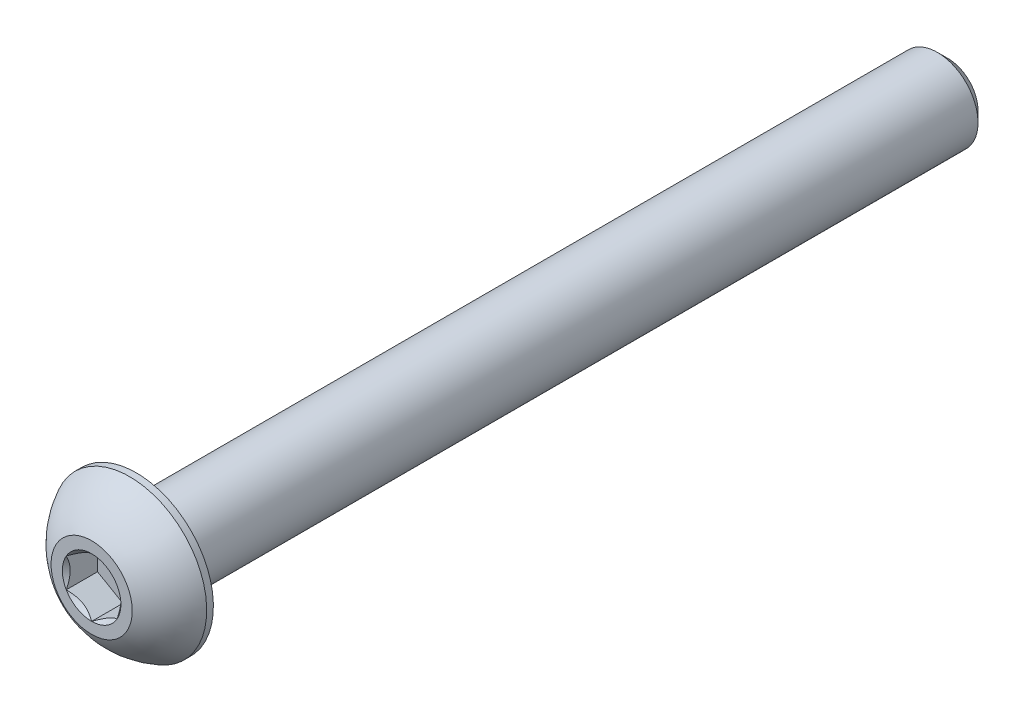
ISO-10303-21;
HEADER;
FILE_DESCRIPTION(('STEP AP214'),'2;1');
FILE_NAME('part.step','',(''),(''),'','','');
FILE_SCHEMA(('AUTOMOTIVE_DESIGN { 1 0 10303 214 1 1 1 1 }'));
ENDSEC;
DATA;
#1=APPLICATION_CONTEXT('core data for automotive mechanical design processes');
#2=APPLICATION_PROTOCOL_DEFINITION('international standard','automotive_design',2000,#1);
#3=PRODUCT_CONTEXT('',#1,'mechanical');
#4=PRODUCT('Part','Part','',(#3));
#5=PRODUCT_RELATED_PRODUCT_CATEGORY('part','',(#4));
#6=PRODUCT_DEFINITION_FORMATION('','',#4);
#7=PRODUCT_DEFINITION_CONTEXT('part definition',#1,'design');
#8=PRODUCT_DEFINITION('design','',#6,#7);
#9=PRODUCT_DEFINITION_SHAPE('','',#8);
#10=(LENGTH_UNIT() NAMED_UNIT(*) SI_UNIT(.MILLI.,.METRE.));
#11=(NAMED_UNIT(*) PLANE_ANGLE_UNIT() SI_UNIT($,.RADIAN.));
#12=(NAMED_UNIT(*) SI_UNIT($,.STERADIAN.) SOLID_ANGLE_UNIT());
#13=UNCERTAINTY_MEASURE_WITH_UNIT(LENGTH_MEASURE(1.E-05),#10,'distance_accuracy_value','');
#14=(GEOMETRIC_REPRESENTATION_CONTEXT(3) GLOBAL_UNCERTAINTY_ASSIGNED_CONTEXT((#13)) GLOBAL_UNIT_ASSIGNED_CONTEXT((#10,
#11,#12)) REPRESENTATION_CONTEXT('',''));
#15=CARTESIAN_POINT('',(0.,0.,0.));
#16=DIRECTION('',(0.,0.,1.));
#17=DIRECTION('',(1.,0.,0.));
#18=AXIS2_PLACEMENT_3D('',#15,#16,#17);
#19=CARTESIAN_POINT('',(0.,0.,22.2));
#20=DIRECTION('',(0.,0.,1.));
#21=DIRECTION('',(0.,-1.,0.));
#22=AXIS2_PLACEMENT_3D('',#19,#20,#21);
#23=CYLINDRICAL_SURFACE('',#22,1.99999999999999);
#24=CARTESIAN_POINT('',(0.,0.,20.));
#25=DIRECTION('',(0.,0.,1.));
#26=DIRECTION('',(0.,-1.,0.));
#27=AXIS2_PLACEMENT_3D('',#24,#25,#26);
#28=CIRCLE('',#27,1.99999999999999);
#29=CARTESIAN_POINT('',(0.,-2.,20.));
#30=VERTEX_POINT('',#29);
#31=EDGE_CURVE('E54',#30,#30,#28,.T.);
#32=ORIENTED_EDGE('',*,*,#31,.F.);
#33=EDGE_LOOP('',(#32));
#34=FACE_BOUND('',#33,.T.);
#35=CARTESIAN_POINT('',(0.,0.,-19.475));
#36=DIRECTION('',(0.,0.,1.));
#37=DIRECTION('',(0.,-1.,0.));
#38=AXIS2_PLACEMENT_3D('',#35,#36,#37);
#39=CIRCLE('',#38,1.99999999999999);
#40=CARTESIAN_POINT('',(0.,-2.,-19.475));
#41=VERTEX_POINT('',#40);
#42=EDGE_CURVE('E182',#41,#41,#39,.T.);
#43=ORIENTED_EDGE('',*,*,#42,.T.);
#44=EDGE_LOOP('',(#43));
#45=FACE_BOUND('',#44,.T.);
#46=ADVANCED_FACE('F41',(#34,#45),#23,.T.);
#47=CARTESIAN_POINT('',(0.,0.,-20.));
#48=DIRECTION('',(0.,0.,1.));
#49=DIRECTION('',(0.,-1.,0.));
#50=AXIS2_PLACEMENT_3D('',#47,#48,#49);
#51=PLANE('',#50);
#52=CARTESIAN_POINT('',(0.,0.,-20.));
#53=DIRECTION('',(0.,0.,1.));
#54=DIRECTION('',(0.,-1.,0.));
#55=AXIS2_PLACEMENT_3D('',#52,#53,#54);
#56=CIRCLE('',#55,1.47499999999999);
#57=CARTESIAN_POINT('',(0.,-1.475,-20.));
#58=VERTEX_POINT('',#57);
#59=EDGE_CURVE('E185',#58,#58,#56,.T.);
#60=ORIENTED_EDGE('',*,*,#59,.F.);
#61=EDGE_LOOP('',(#60));
#62=FACE_BOUND('',#61,.T.);
#63=ADVANCED_FACE('F194',(#62),#51,.F.);
#64=CARTESIAN_POINT('',(0.,0.,-20.));
#65=DIRECTION('',(0.,0.,1.));
#66=DIRECTION('',(0.,-1.,0.));
#67=AXIS2_PLACEMENT_3D('',#64,#65,#66);
#68=CONICAL_SURFACE('',#67,1.47499999999999,0.785398163397449);
#69=ORIENTED_EDGE('',*,*,#42,.F.);
#70=EDGE_LOOP('',(#69));
#71=FACE_BOUND('',#70,.T.);
#72=ORIENTED_EDGE('',*,*,#59,.T.);
#73=EDGE_LOOP('',(#72));
#74=FACE_BOUND('',#73,.T.);
#75=ADVANCED_FACE('F197',(#71,#74),#68,.T.);
#76=CARTESIAN_POINT('',(0.,-3.79999999999999,20.));
#77=DIRECTION('',(0.,0.,1.));
#78=DIRECTION('',(0.,-1.,0.));
#79=AXIS2_PLACEMENT_3D('',#76,#77,#78);
#80=PLANE('',#79);
#81=CARTESIAN_POINT('',(0.,0.,20.));
#82=DIRECTION('',(0.,0.,1.));
#83=DIRECTION('',(0.,-1.,0.));
#84=AXIS2_PLACEMENT_3D('',#81,#82,#83);
#85=CIRCLE('',#84,3.79999999999999);
#86=CARTESIAN_POINT('',(0.,-3.79999999999999,20.));
#87=VERTEX_POINT('',#86);
#88=EDGE_CURVE('E176',#87,#87,#85,.T.);
#89=ORIENTED_EDGE('',*,*,#88,.F.);
#90=EDGE_LOOP('',(#89));
#91=FACE_BOUND('',#90,.T.);
#92=ORIENTED_EDGE('',*,*,#31,.T.);
#93=EDGE_LOOP('',(#92));
#94=FACE_BOUND('',#93,.T.);
#95=ADVANCED_FACE('F190',(#91,#94),#80,.F.);
#96=CARTESIAN_POINT('',(0.,0.,18.4735561497326));
#97=DIRECTION('',(0.,0.,1.));
#98=DIRECTION('',(0.,-1.,0.));
#99=AXIS2_PLACEMENT_3D('',#96,#97,#98);
#100=SPHERICAL_SURFACE('',#99,4.22922968981298);
#101=CARTESIAN_POINT('',(0.,0.,22.2));
#102=DIRECTION('',(0.,0.,1.));
#103=DIRECTION('',(0.,-1.,0.));
#104=AXIS2_PLACEMENT_3D('',#101,#102,#103);
#105=CIRCLE('',#104,1.99999999999998);
#106=CARTESIAN_POINT('',(0.,-1.99999999999998,22.2));
#107=VERTEX_POINT('',#106);
#108=EDGE_CURVE('E179',#107,#107,#105,.T.);
#109=CARTESIAN_POINT('',(0.,0.,20.33));
#110=DIRECTION('',(0.,0.,1.));
#111=DIRECTION('',(0.,-1.,0.));
#112=AXIS2_PLACEMENT_3D('',#109,#110,#111);
#113=CIRCLE('',#112,3.79999999999999);
#114=CARTESIAN_POINT('',(0.,-3.79999999999999,20.33));
#115=VERTEX_POINT('',#114);
#116=EDGE_CURVE('E173',#115,#115,#113,.T.);
#117=CARTESIAN_POINT('',(0.,-1.99999999999998,22.2));
#118=CARTESIAN_POINT('',(0.,-2.02421343985612,22.1870045740355));
#119=CARTESIAN_POINT('',(0.,-2.04830018323972,22.1737730870349));
#120=CARTESIAN_POINT('',(0.,-2.09621120342124,22.1468431584943));
#121=CARTESIAN_POINT('',(0.,-2.12003548021915,22.1331447169543));
#122=CARTESIAN_POINT('',(0.,-2.16741249358865,22.105286046868));
#123=CARTESIAN_POINT('',(0.,-2.19096523016024,22.0911258183216));
#124=CARTESIAN_POINT('',(0.,-2.23779021933681,22.062348964764));
#125=CARTESIAN_POINT('',(0.,-2.26106247194179,22.0477323397528));
#126=CARTESIAN_POINT('',(0.,-2.3073176488607,22.0180482444859));
#127=CARTESIAN_POINT('',(0.,-2.33030057317463,22.0029807742302));
#128=CARTESIAN_POINT('',(0.,-2.37596836104233,21.9724007144171));
#129=CARTESIAN_POINT('',(0.,-2.3986532245961,21.9568881248597));
#130=CARTESIAN_POINT('',(0.,-2.44371627121512,21.9254237206041));
#131=CARTESIAN_POINT('',(0.,-2.46609445428036,21.9094719059059));
#132=CARTESIAN_POINT('',(0.,-2.5105356368618,21.8771351126683));
#133=CARTESIAN_POINT('',(0.,-2.53259863637799,21.8607501341289));
#134=CARTESIAN_POINT('',(0.,-2.5764010685249,21.8275532390328));
#135=CARTESIAN_POINT('',(0.,-2.59814050115562,21.8107413224761));
#136=CARTESIAN_POINT('',(0.,-2.64128753915152,21.7766969394119));
#137=CARTESIAN_POINT('',(0.,-2.66269514451669,21.7594644729043));
#138=CARTESIAN_POINT('',(0.,-2.70517039368394,21.724585537797));
#139=CARTESIAN_POINT('',(0.,-2.72623803748601,21.7069390691974));
#140=CARTESIAN_POINT('',(0.,-2.76802535840617,21.6712388350756));
#141=CARTESIAN_POINT('',(0.,-2.78874503552427,21.6531850695534));
#142=CARTESIAN_POINT('',(0.,-2.82982855017312,21.6166771015172));
#143=CARTESIAN_POINT('',(0.,-2.85019238770387,21.5982228990032));
#144=CARTESIAN_POINT('',(0.,-2.89055648548393,21.560921069069));
#145=CARTESIAN_POINT('',(0.,-2.91055674573322,21.5420734416488));
#146=CARTESIAN_POINT('',(0.,-2.95018608940551,21.5039919234787));
#147=CARTESIAN_POINT('',(0.,-2.96981517282851,21.4847580327288));
#148=CARTESIAN_POINT('',(0.,-3.00869470434026,21.4459112962447));
#149=CARTESIAN_POINT('',(0.,-3.02794515242902,21.4262984505106));
#150=CARTESIAN_POINT('',(0.,-3.06606009863532,21.3867012563963));
#151=CARTESIAN_POINT('',(0.,-3.08492459675285,21.3667169080161));
#152=CARTESIAN_POINT('',(0.,-3.12226047503001,21.3263843021083));
#153=CARTESIAN_POINT('',(0.,-3.14073185518963,21.3060360445808));
#154=CARTESIAN_POINT('',(0.,-3.1772744789382,21.2649833521526));
#155=CARTESIAN_POINT('',(0.,-3.19534572252714,21.2442789172519));
#156=CARTESIAN_POINT('',(0.,-3.23108120656241,21.202521737189));
#157=CARTESIAN_POINT('',(0.,-3.24874544700874,21.1814689920269));
#158=CARTESIAN_POINT('',(0.,-3.28366021283672,21.139023190901));
#159=CARTESIAN_POINT('',(0.,-3.30091073821837,21.1176301349374));
#160=CARTESIAN_POINT('',(0.,-3.33499151919533,21.0745118409772));
#161=CARTESIAN_POINT('',(0.,-3.35182177479063,21.0527866029806));
#162=CARTESIAN_POINT('',(0.,-3.3850556211637,21.0090121999432));
#163=CARTESIAN_POINT('',(0.,-3.40145921194148,20.9869630349023));
#164=CARTESIAN_POINT('',(0.,-3.43383349577046,20.9425491558485));
#165=CARTESIAN_POINT('',(0.,-3.44980418882165,20.9201844418356));
#166=CARTESIAN_POINT('',(0.,-3.48130660877274,20.8751479628077));
#167=CARTESIAN_POINT('',(0.,-3.49683833567263,20.8524761977926));
#168=CARTESIAN_POINT('',(0.,-3.5274569217093,20.8068342314103));
#169=CARTESIAN_POINT('',(0.,-3.54254378084609,20.7838640300431));
#170=CARTESIAN_POINT('',(0.,-3.57226689871517,20.7376339189694));
#171=CARTESIAN_POINT('',(0.,-3.58690315744747,20.7143740092629));
#172=CARTESIAN_POINT('',(0.,-3.61571951333198,20.6675733197334));
#173=CARTESIAN_POINT('',(0.,-3.62989961048421,20.6440325399103));
#174=CARTESIAN_POINT('',(0.,-3.65779825442822,20.5966790546141));
#175=CARTESIAN_POINT('',(0.,-3.67151680122002,20.5728663491409));
#176=CARTESIAN_POINT('',(0.,-3.69848713452321,20.5249780621223));
#177=CARTESIAN_POINT('',(0.,-3.71173892103461,20.5009024805769));
#178=CARTESIAN_POINT('',(0.,-3.73777068821037,20.4524975842079));
#179=CARTESIAN_POINT('',(0.,-3.75055066887473,20.4281682693843));
#180=CARTESIAN_POINT('',(0.,-3.77563400658953,20.3792651705548));
#181=CARTESIAN_POINT('',(0.,-3.78793736363996,20.354691386549));
#182=CARTESIAN_POINT('',(0.,-3.79999999999999,20.33));
#183=B_SPLINE_CURVE_WITH_KNOTS('',3,(#117,#118,#119,#120,#121,#122,#123,#124,#125,#126,#127,
#128,#129,#130,#131,#132,#133,#134,#135,#136,#137,#138,#139,#140,#141,#142,#143,#144,#145,#146,
#147,#148,#149,#150,#151,#152,#153,#154,#155,#156,#157,#158,#159,#160,#161,#162,#163,#164,#165,
#166,#167,#168,#169,#170,#171,#172,#173,#174,#175,#176,#177,#178,#179,#180,#181,#182),
.UNSPECIFIED.,.F.,.F.,(4,2,2,2,2,2,2,2,2,2,2,2,2,2,2,2,2,2,2,2,2,2,2,2,2,2,2,2,2,2,2,2,4),(0.,
0.0824398589102662,0.16487971782053,0.247319576730794,0.329759435641058,0.412199294551324,
0.494639153461589,0.577079012371851,0.659518871282117,0.741958730192382,0.824398589102647,
0.906838448012911,0.989278306923174,1.07171816583344,1.1541580247437,1.23659788365397,
1.31903774256423,1.4014776014745,1.48391746038476,1.56635731929503,1.64879717820529,
1.73123703711555,1.81367689602582,1.89611675493608,1.97855661384635,2.06099647275661,
2.14343633166688,2.22587619057714,2.30831604948741,2.39075590839767,2.47319576730794,
2.5556356262182,2.63807548512846),.UNSPECIFIED.);
#184=EDGE_CURVE('BSEAM207',#107,#115,#183,.T.);
#185=ORIENTED_EDGE('',*,*,#108,.F.);
#186=ORIENTED_EDGE('',*,*,#116,.T.);
#187=ORIENTED_EDGE('',*,*,#184,.T.);
#188=ORIENTED_EDGE('',*,*,#184,.F.);
#189=EDGE_LOOP('',(#185,#187,#186,#188));
#190=FACE_BOUND('',#189,.T.);
#191=ADVANCED_FACE('F207',(#190),#100,.T.);
#192=CARTESIAN_POINT('',(0.,-1.99999999999999,22.2));
#193=DIRECTION('',(0.,0.,-1.));
#194=DIRECTION('',(0.,1.,0.));
#195=AXIS2_PLACEMENT_3D('',#192,#193,#194);
#196=PLANE('',#195);
#197=CARTESIAN_POINT('',(0.,0.,22.2));
#198=DIRECTION('',(0.,0.,1.));
#199=DIRECTION('',(1.,0.,0.));
#200=AXIS2_PLACEMENT_3D('',#197,#198,#199);
#201=CIRCLE('',#200,1.44337567297405);
#202=CARTESIAN_POINT('',(0.,1.44337567297405,22.2));
#203=VERTEX_POINT('',#202);
#204=CARTESIAN_POINT('',(-1.24999999999998,0.721687836487031,22.2));
#205=VERTEX_POINT('',#204);
#206=EDGE_CURVE('E140',#203,#205,#201,.T.);
#207=ORIENTED_EDGE('',*,*,#206,.F.);
#208=CARTESIAN_POINT('',(1.24999999999999,0.721687836487024,22.2));
#209=VERTEX_POINT('',#208);
#210=EDGE_CURVE('E137',#209,#203,#201,.T.);
#211=ORIENTED_EDGE('',*,*,#210,.F.);
#212=CARTESIAN_POINT('',(1.24999999999999,-0.721687836487023,22.2));
#213=VERTEX_POINT('',#212);
#214=EDGE_CURVE('E107',#213,#209,#201,.T.);
#215=ORIENTED_EDGE('',*,*,#214,.F.);
#216=CARTESIAN_POINT('',(0.,-1.44337567297405,22.2));
#217=VERTEX_POINT('',#216);
#218=EDGE_CURVE('E99',#217,#213,#201,.T.);
#219=ORIENTED_EDGE('',*,*,#218,.F.);
#220=CARTESIAN_POINT('',(-1.24999999999999,-0.721687836487024,22.2));
#221=VERTEX_POINT('',#220);
#222=EDGE_CURVE('E60',#221,#217,#201,.T.);
#223=ORIENTED_EDGE('',*,*,#222,.F.);
#224=EDGE_CURVE('E67',#205,#221,#201,.T.);
#225=ORIENTED_EDGE('',*,*,#224,.F.);
#226=EDGE_LOOP('',(#207,#211,#215,#219,#223,#225));
#227=FACE_BOUND('',#226,.T.);
#228=ORIENTED_EDGE('',*,*,#108,.T.);
#229=EDGE_LOOP('',(#228));
#230=FACE_BOUND('',#229,.T.);
#231=ADVANCED_FACE('F134',(#227,#230),#196,.F.);
#232=CARTESIAN_POINT('',(0.,0.,22.2));
#233=DIRECTION('',(0.,0.,1.));
#234=DIRECTION('',(0.,-1.,0.));
#235=AXIS2_PLACEMENT_3D('',#232,#233,#234);
#236=CYLINDRICAL_SURFACE('',#235,3.79999999999999);
#237=ORIENTED_EDGE('',*,*,#116,.F.);
#238=EDGE_LOOP('',(#237));
#239=FACE_BOUND('',#238,.T.);
#240=ORIENTED_EDGE('',*,*,#88,.T.);
#241=EDGE_LOOP('',(#240));
#242=FACE_BOUND('',#241,.T.);
#243=ADVANCED_FACE('F213',(#239,#242),#236,.T.);
#244=CARTESIAN_POINT('',(0.,0.,22.2));
#245=DIRECTION('',(0.,0.,1.));
#246=DIRECTION('',(1.,0.,0.));
#247=AXIS2_PLACEMENT_3D('',#244,#245,#246);
#248=CONICAL_SURFACE('',#247,1.44337567297405,0.78539816339745);
#249=ORIENTED_EDGE('',*,*,#214,.T.);
#250=CARTESIAN_POINT('',(1.24999999999999,-1.43934010808074,22.6629820968923));
#251=CARTESIAN_POINT('',(1.24999999999999,-1.40429313005656,22.6365249226329));
#252=CARTESIAN_POINT('',(1.24999999999999,-1.36905087135596,22.6103271603543));
#253=CARTESIAN_POINT('',(1.24999999999999,-1.29809650706308,22.5585575718396));
#254=CARTESIAN_POINT('',(1.24999999999999,-1.26238428576493,22.5329859043563));
#255=CARTESIAN_POINT('',(1.24999999999999,-1.15390111792705,22.4570059936895));
#256=CARTESIAN_POINT('',(1.24999999999999,-1.08031646726262,22.4077402861896));
#257=CARTESIAN_POINT('',(1.24999999999999,-0.926012322755073,22.3110258302631));
#258=CARTESIAN_POINT('',(1.24999999999999,-0.845125318656126,22.2638412989418));
#259=CARTESIAN_POINT('',(1.24999999999999,-0.679311174076585,22.1775307343904));
#260=CARTESIAN_POINT('',(1.24999999999999,-0.594398891026673,22.1383775346269));
#261=CARTESIAN_POINT('',(1.24999999999999,-0.466944812460728,22.0904772236883));
#262=CARTESIAN_POINT('',(1.24999999999999,-0.42628998581281,22.0767294897863));
#263=CARTESIAN_POINT('',(1.24999999999999,-0.343998850091258,22.0524979274505));
#264=CARTESIAN_POINT('',(1.24999999999999,-0.302362473614954,22.0420143238698));
#265=CARTESIAN_POINT('',(1.24999999999999,-0.219052696285659,22.0250301617483));
#266=CARTESIAN_POINT('',(1.24999999999999,-0.177393428474494,22.0184613604714));
#267=CARTESIAN_POINT('',(1.24999999999999,-0.0936293693401874,22.0094350534578));
#268=CARTESIAN_POINT('',(1.24999999999999,-0.0515246558543922,22.0069768409973));
#269=CARTESIAN_POINT('',(1.24999999999999,0.0311890576306342,22.0063540620133));
#270=CARTESIAN_POINT('',(1.24999999999999,0.0717969625499327,22.0080371168462));
#271=CARTESIAN_POINT('',(1.24999999999999,0.152668636885199,22.0152682705979));
#272=CARTESIAN_POINT('',(1.24999999999999,0.192932338835359,22.0208171104131));
#273=CARTESIAN_POINT('',(1.24999999999999,0.273499879165296,22.035571036465));
#274=CARTESIAN_POINT('',(1.24999999999999,0.313792180618511,22.0448381759641));
#275=CARTESIAN_POINT('',(1.24999999999999,0.393496413911456,22.0665361784573));
#276=CARTESIAN_POINT('',(1.24999999999999,0.432908419115057,22.0789667767306));
#277=CARTESIAN_POINT('',(1.24999999999999,0.556992735862295,22.1227793529314));
#278=CARTESIAN_POINT('',(1.24999999999999,0.639898924666083,22.159151072876));
#279=CARTESIAN_POINT('',(1.24999999999999,0.801816555499699,22.2400191621783));
#280=CARTESIAN_POINT('',(1.24999999999999,0.880812666325041,22.284544720912));
#281=CARTESIAN_POINT('',(1.24999999999999,1.03178561279749,22.3764048766666));
#282=CARTESIAN_POINT('',(1.24999999999999,1.10391618485085,22.4234899339163));
#283=CARTESIAN_POINT('',(1.24999999999999,1.2101860604331,22.4962785615985));
#284=CARTESIAN_POINT('',(1.24999999999999,1.24515069969379,22.5207980853934));
#285=CARTESIAN_POINT('',(1.24999999999999,1.31460220852736,22.5704856367657));
#286=CARTESIAN_POINT('',(1.24999999999999,1.34908920596617,22.5956534854155));
#287=CARTESIAN_POINT('',(1.24999999999999,1.38337731682911,22.6210901488412));
#288=B_SPLINE_CURVE_WITH_KNOTS('',3,(#250,#251,#252,#253,#254,#255,#256,#257,#258,#259,#260,
#261,#262,#263,#264,#265,#266,#267,#268,#269,#270,#271,#272,#273,#274,#275,#276,#277,#278,#279,
#280,#281,#282,#283,#284,#285,#286,#287),.UNSPECIFIED.,.F.,.F.,(4,2,2,2,2,2,2,2,2,2,2,2,2,2,2,2,
2,2,4),(0.,0.131732960381445,0.26349898416164,0.529042014455814,0.809741926134603,
1.08947609717223,1.21811634272574,1.34676544783898,1.47310084517841,1.59941451973781,
1.72115042167846,1.84290966131731,1.96679153905338,2.09066305366035,2.36146692896005,
2.63325989198487,2.89154668212275,3.01965734507708,3.14773302245623),.UNSPECIFIED.);
#289=EDGE_CURVE('E11',#213,#209,#288,.T.);
#290=ORIENTED_EDGE('',*,*,#289,.F.);
#291=EDGE_LOOP('',(#249,#290));
#292=FACE_BOUND('',#291,.T.);
#293=ADVANCED_FACE('F111',(#292),#248,.F.);
#294=ORIENTED_EDGE('',*,*,#210,.T.);
#295=CARTESIAN_POINT('',(1.25019999999999,0.721572366433191,22.2001154839091));
#296=CARTESIAN_POINT('',(1.2072248329284,0.746384090710441,22.1753216680551));
#297=CARTESIAN_POINT('',(1.16353099525404,0.77161073965366,22.1519837344187));
#298=CARTESIAN_POINT('',(1.07443406915805,0.82305087391915,22.1092520040845));
#299=CARTESIAN_POINT('',(1.02902250164292,0.849269254648328,22.0898819923604));
#300=CARTESIAN_POINT('',(0.93745217906473,0.90213740503863,22.0567004834135));
#301=CARTESIAN_POINT('',(0.891316759824104,0.928773701756381,22.0428055590527));
#302=CARTESIAN_POINT('',(0.798029919592398,0.982632884076006,22.0213972821606));
#303=CARTESIAN_POINT('',(0.750881350863611,1.00985412292348,22.0138679415668));
#304=CARTESIAN_POINT('',(0.66962644311274,1.05676666578642,22.0070744980507));
#305=CARTESIAN_POINT('',(0.635625123372051,1.07639733689151,22.0060685591044));
#306=CARTESIAN_POINT('',(0.567682235567516,1.11562418145498,22.0077614149113));
#307=CARTESIAN_POINT('',(0.533740682344336,1.1352203463451,22.0104610272155));
#308=CARTESIAN_POINT('',(0.466185143542494,1.17422355485759,22.0194089303164));
#309=CARTESIAN_POINT('',(0.432571492713219,1.19363040521232,22.0256605258997));
#310=CARTESIAN_POINT('',(0.365905361782182,1.23212011385118,22.0413756814139));
#311=CARTESIAN_POINT('',(0.332853128969699,1.25120282936279,22.0508406200875));
#312=CARTESIAN_POINT('',(0.248200308399732,1.30007715810652,22.0789313906876));
#313=CARTESIAN_POINT('',(0.197133507570359,1.32956058931201,22.0996701574522));
#314=CARTESIAN_POINT('',(0.0969991458867442,1.38737318998518,22.1463871346715));
#315=CARTESIAN_POINT('',(0.0479256884217302,1.41570576386267,22.1723482959468));
#316=CARTESIAN_POINT('',(-0.000199999999999777,1.44349114302789,22.2001154839091));
#317=B_SPLINE_CURVE_WITH_KNOTS('',3,(#295,#296,#297,#298,#299,#300,#301,#302,#303,#304,#305,
#306,#307,#308,#309,#310,#311,#312,#313,#314,#315,#316),.UNSPECIFIED.,.F.,.F.,(4,2,2,2,2,2,2,2,
2,2,4),(0.,0.1665334096183,0.334037607289757,0.498880396489691,0.663307919240266,
0.780963963458817,0.898645970148442,1.01643764860772,1.13427993171548,1.32148652032139,
1.50809158792572),.UNSPECIFIED.);
#318=EDGE_CURVE('E139',#209,#203,#317,.T.);
#319=ORIENTED_EDGE('',*,*,#318,.F.);
#320=EDGE_LOOP('',(#294,#319));
#321=FACE_BOUND('',#320,.T.);
#322=ADVANCED_FACE('F292',(#321),#248,.F.);
#323=ORIENTED_EDGE('',*,*,#206,.T.);
#324=CARTESIAN_POINT('',(0.000199999999999752,1.44349114302789,22.2001154839091));
#325=CARTESIAN_POINT('',(-0.0427751670715864,1.41867941875064,22.1753216680551));
#326=CARTESIAN_POINT('',(-0.0864690047459476,1.39345276980742,22.1519837344187));
#327=CARTESIAN_POINT('',(-0.175565930841941,1.34201263554193,22.1092520040845));
#328=CARTESIAN_POINT('',(-0.220977498357063,1.31579425481275,22.0898819923604));
#329=CARTESIAN_POINT('',(-0.312547820935258,1.26292610442245,22.0567004834135));
#330=CARTESIAN_POINT('',(-0.358683240175883,1.2362898077047,22.0428055590527));
#331=CARTESIAN_POINT('',(-0.451970080407589,1.18243062538507,22.0213972821606));
#332=CARTESIAN_POINT('',(-0.499118649136376,1.1552093865376,22.0138679415668));
#333=CARTESIAN_POINT('',(-0.580373556887248,1.10829684367466,22.0070744980507));
#334=CARTESIAN_POINT('',(-0.614374876627937,1.08866617256957,22.0060685591044));
#335=CARTESIAN_POINT('',(-0.682317764432473,1.0494393280061,22.0077614149113));
#336=CARTESIAN_POINT('',(-0.716259317655652,1.02984316311598,22.0104610272155));
#337=CARTESIAN_POINT('',(-0.783814856457494,0.990839954603491,22.0194089303164));
#338=CARTESIAN_POINT('',(-0.817428507286769,0.971433104248763,22.0256605258997));
#339=CARTESIAN_POINT('',(-0.884094638217807,0.932943395609897,22.0413756814139));
#340=CARTESIAN_POINT('',(-0.917146871030289,0.913860680098292,22.0508406200875));
#341=CARTESIAN_POINT('',(-1.00179969160026,0.86498635135456,22.0789313906876));
#342=CARTESIAN_POINT('',(-1.05286649242963,0.835502920149069,22.0996701574522));
#343=CARTESIAN_POINT('',(-1.15300085411324,0.777690319475904,22.1463871346715));
#344=CARTESIAN_POINT('',(-1.20207431157826,0.749357745598413,22.1723482959468));
#345=CARTESIAN_POINT('',(-1.25019999999998,0.721572366433191,22.2001154839091));
#346=B_SPLINE_CURVE_WITH_KNOTS('',3,(#324,#325,#326,#327,#328,#329,#330,#331,#332,#333,#334,
#335,#336,#337,#338,#339,#340,#341,#342,#343,#344,#345),.UNSPECIFIED.,.F.,.F.,(4,2,2,2,2,2,2,2,
2,2,4),(0.,0.166533409618303,0.334037607289759,0.498880396489694,0.663307919240269,
0.780963963458821,0.898645970148446,1.01643764860773,1.13427993171549,1.32148652032139,
1.50809158792572),.UNSPECIFIED.);
#347=EDGE_CURVE('E143',#203,#205,#346,.T.);
#348=ORIENTED_EDGE('',*,*,#347,.F.);
#349=EDGE_LOOP('',(#323,#348));
#350=FACE_BOUND('',#349,.T.);
#351=ADVANCED_FACE('F146',(#350),#248,.F.);
#352=ORIENTED_EDGE('',*,*,#224,.T.);
#353=CARTESIAN_POINT('',(-1.24999999999999,-1.43934010808074,22.6629820968923));
#354=CARTESIAN_POINT('',(-1.24999999999999,-1.40429313005656,22.6365249226329));
#355=CARTESIAN_POINT('',(-1.24999999999999,-1.36905087135597,22.6103271603543));
#356=CARTESIAN_POINT('',(-1.24999999999999,-1.29809650706308,22.5585575718396));
#357=CARTESIAN_POINT('',(-1.24999999999999,-1.26238428576493,22.5329859043563));
#358=CARTESIAN_POINT('',(-1.24999999999999,-1.15390111792706,22.4570059936895));
#359=CARTESIAN_POINT('',(-1.24999999999999,-1.08031646726262,22.4077402861896));
#360=CARTESIAN_POINT('',(-1.24999999999999,-0.926012322755076,22.3110258302631));
#361=CARTESIAN_POINT('',(-1.24999999999999,-0.845125318656129,22.2638412989418));
#362=CARTESIAN_POINT('',(-1.24999999999999,-0.679311174076588,22.1775307343904));
#363=CARTESIAN_POINT('',(-1.24999999999999,-0.594398891026677,22.1383775346269));
#364=CARTESIAN_POINT('',(-1.24999999999999,-0.466944812460732,22.0904772236883));
#365=CARTESIAN_POINT('',(-1.24999999999999,-0.426289985812813,22.0767294897863));
#366=CARTESIAN_POINT('',(-1.24999999999999,-0.34399885009126,22.0524979274505));
#367=CARTESIAN_POINT('',(-1.24999999999999,-0.302362473614956,22.0420143238698));
#368=CARTESIAN_POINT('',(-1.24999999999999,-0.219052696285661,22.0250301617483));
#369=CARTESIAN_POINT('',(-1.24999999999999,-0.177393428474496,22.0184613604714));
#370=CARTESIAN_POINT('',(-1.24999999999999,-0.0936293693401889,22.0094350534578));
#371=CARTESIAN_POINT('',(-1.24999999999999,-0.0515246558543934,22.0069768409973));
#372=CARTESIAN_POINT('',(-1.24999999999999,0.0311890576306331,22.0063540620133));
#373=CARTESIAN_POINT('',(-1.24999999999999,0.0717969625499313,22.0080371168462));
#374=CARTESIAN_POINT('',(-1.24999999999999,0.152668636885197,22.0152682705979));
#375=CARTESIAN_POINT('',(-1.24999999999999,0.192932338835357,22.0208171104131));
#376=CARTESIAN_POINT('',(-1.24999999999999,0.273499879165293,22.035571036465));
#377=CARTESIAN_POINT('',(-1.24999999999999,0.313792180618508,22.0448381759641));
#378=CARTESIAN_POINT('',(-1.24999999999999,0.393496413911453,22.0665361784573));
#379=CARTESIAN_POINT('',(-1.24999999999999,0.432908419115055,22.0789667767306));
#380=CARTESIAN_POINT('',(-1.24999999999999,0.556992735862293,22.1227793529314));
#381=CARTESIAN_POINT('',(-1.24999999999999,0.639898924666079,22.159151072876));
#382=CARTESIAN_POINT('',(-1.24999999999999,0.801816555499693,22.2400191621783));
#383=CARTESIAN_POINT('',(-1.24999999999999,0.880812666325035,22.284544720912));
#384=CARTESIAN_POINT('',(-1.24999999999999,1.03178561279749,22.3764048766666));
#385=CARTESIAN_POINT('',(-1.24999999999999,1.10391618485084,22.4234899339162));
#386=CARTESIAN_POINT('',(-1.24999999999999,1.21018606043309,22.4962785615985));
#387=CARTESIAN_POINT('',(-1.24999999999999,1.24515069969378,22.5207980853934));
#388=CARTESIAN_POINT('',(-1.24999999999999,1.31460220852735,22.5704856367657));
#389=CARTESIAN_POINT('',(-1.24999999999999,1.34908920596617,22.5956534854155));
#390=CARTESIAN_POINT('',(-1.24999999999999,1.3833773168291,22.6210901488412));
#391=B_SPLINE_CURVE_WITH_KNOTS('',3,(#353,#354,#355,#356,#357,#358,#359,#360,#361,#362,#363,
#364,#365,#366,#367,#368,#369,#370,#371,#372,#373,#374,#375,#376,#377,#378,#379,#380,#381,#382,
#383,#384,#385,#386,#387,#388,#389,#390),.UNSPECIFIED.,.F.,.F.,(4,2,2,2,2,2,2,2,2,2,2,2,2,2,2,2,
2,2,4),(0.,0.131732960381446,0.263498984161639,0.529042014455817,0.809741926134605,
1.08947609717223,1.21811634272574,1.34676544783898,1.47310084517841,1.59941451973781,
1.72115042167846,1.84290966131731,1.96679153905338,2.09066305366036,2.36146692896005,
2.63325989198487,2.89154668212275,3.01965734507708,3.14773302245623),.UNSPECIFIED.);
#392=EDGE_CURVE('E149',#205,#221,#391,.F.);
#393=ORIENTED_EDGE('',*,*,#392,.F.);
#394=EDGE_LOOP('',(#352,#393));
#395=FACE_BOUND('',#394,.T.);
#396=ADVANCED_FACE('F150',(#395),#248,.F.);
#397=ORIENTED_EDGE('',*,*,#222,.T.);
#398=CARTESIAN_POINT('',(-1.25019999999999,-0.721572366433181,22.2001154839091));
#399=CARTESIAN_POINT('',(-1.2072248329284,-0.74638409071043,22.1753216680551));
#400=CARTESIAN_POINT('',(-1.16353099525404,-0.771610739653651,22.1519837344187));
#401=CARTESIAN_POINT('',(-1.07443406915804,-0.823050873919141,22.1092520040845));
#402=CARTESIAN_POINT('',(-1.02902250164292,-0.849269254648319,22.0898819923604));
#403=CARTESIAN_POINT('',(-0.937452179064729,-0.90213740503862,22.0567004834135));
#404=CARTESIAN_POINT('',(-0.891316759824104,-0.928773701756372,22.0428055590527));
#405=CARTESIAN_POINT('',(-0.798029919592398,-0.982632884075997,22.0213972821606));
#406=CARTESIAN_POINT('',(-0.750881350863611,-1.00985412292347,22.0138679415668));
#407=CARTESIAN_POINT('',(-0.669626443112739,-1.05676666578641,22.0070744980507));
#408=CARTESIAN_POINT('',(-0.635625123372051,-1.0763973368915,22.0060685591043));
#409=CARTESIAN_POINT('',(-0.567682235567515,-1.11562418145497,22.0077614149113));
#410=CARTESIAN_POINT('',(-0.533740682344336,-1.13522034634509,22.0104610272155));
#411=CARTESIAN_POINT('',(-0.466185143542494,-1.17422355485758,22.0194089303164));
#412=CARTESIAN_POINT('',(-0.43257149271322,-1.19363040521231,22.0256605258997));
#413=CARTESIAN_POINT('',(-0.365905361782182,-1.23212011385117,22.0413756814139));
#414=CARTESIAN_POINT('',(-0.332853128969701,-1.25120282936278,22.0508406200875));
#415=CARTESIAN_POINT('',(-0.248200308399733,-1.30007715810651,22.0789313906876));
#416=CARTESIAN_POINT('',(-0.19713350757036,-1.329560589312,22.0996701574522));
#417=CARTESIAN_POINT('',(-0.0969991458867441,-1.38737318998517,22.1463871346715));
#418=CARTESIAN_POINT('',(-0.0479256884217301,-1.41570576386266,22.1723482959468));
#419=CARTESIAN_POINT('',(0.000199999999999768,-1.44349114302788,22.2001154839091));
#420=B_SPLINE_CURVE_WITH_KNOTS('',3,(#398,#399,#400,#401,#402,#403,#404,#405,#406,#407,#408,
#409,#410,#411,#412,#413,#414,#415,#416,#417,#418,#419),.UNSPECIFIED.,.F.,.F.,(4,2,2,2,2,2,2,2,
2,2,4),(0.,0.166533409618303,0.334037607289758,0.498880396489692,0.663307919240268,
0.780963963458818,0.898645970148443,1.01643764860772,1.13427993171548,1.32148652032139,
1.50809158792572),.UNSPECIFIED.);
#421=EDGE_CURVE('E123',#221,#217,#420,.T.);
#422=ORIENTED_EDGE('',*,*,#421,.F.);
#423=EDGE_LOOP('',(#397,#422));
#424=FACE_BOUND('',#423,.T.);
#425=ADVANCED_FACE('F241',(#424),#248,.F.);
#426=ORIENTED_EDGE('',*,*,#218,.T.);
#427=CARTESIAN_POINT('',(-0.000199999999999298,-1.44349114302788,22.2001154839091));
#428=CARTESIAN_POINT('',(0.0427751670715873,-1.41867941875063,22.1753216680551));
#429=CARTESIAN_POINT('',(0.0864690047459478,-1.39345276980741,22.1519837344187));
#430=CARTESIAN_POINT('',(0.17556593084194,-1.34201263554192,22.1092520040845));
#431=CARTESIAN_POINT('',(0.220977498357062,-1.31579425481274,22.0898819923604));
#432=CARTESIAN_POINT('',(0.312547820935257,-1.26292610442244,22.0567004834135));
#433=CARTESIAN_POINT('',(0.358683240175882,-1.23628980770469,22.0428055590527));
#434=CARTESIAN_POINT('',(0.451970080407588,-1.18243062538507,22.0213972821606));
#435=CARTESIAN_POINT('',(0.499118649136374,-1.15520938653759,22.0138679415668));
#436=CARTESIAN_POINT('',(0.580373556887245,-1.10829684367465,22.0070744980507));
#437=CARTESIAN_POINT('',(0.614374876627934,-1.08866617256956,22.0060685591043));
#438=CARTESIAN_POINT('',(0.682317764432469,-1.04943932800609,22.0077614149113));
#439=CARTESIAN_POINT('',(0.716259317655649,-1.02984316311598,22.0104610272155));
#440=CARTESIAN_POINT('',(0.78381485645749,-0.990839954603483,22.0194089303164));
#441=CARTESIAN_POINT('',(0.817428507286764,-0.971433104248755,22.0256605258997));
#442=CARTESIAN_POINT('',(0.884094638217801,-0.93294339560989,22.0413756814139));
#443=CARTESIAN_POINT('',(0.917146871030284,-0.913860680098285,22.0508406200875));
#444=CARTESIAN_POINT('',(1.00179969160025,-0.864986351354553,22.0789313906876));
#445=CARTESIAN_POINT('',(1.05286649242963,-0.835502920149061,22.0996701574522));
#446=CARTESIAN_POINT('',(1.15300085411324,-0.777690319475894,22.1463871346715));
#447=CARTESIAN_POINT('',(1.20207431157826,-0.749357745598402,22.1723482959468));
#448=CARTESIAN_POINT('',(1.25019999999999,-0.721572366433181,22.2001154839091));
#449=B_SPLINE_CURVE_WITH_KNOTS('',3,(#427,#428,#429,#430,#431,#432,#433,#434,#435,#436,#437,
#438,#439,#440,#441,#442,#443,#444,#445,#446,#447,#448),.UNSPECIFIED.,.F.,.F.,(4,2,2,2,2,2,2,2,
2,2,4),(0.,0.1665334096183,0.334037607289758,0.498880396489691,0.663307919240266,
0.780963963458816,0.898645970148441,1.01643764860772,1.13427993171548,1.32148652032139,
1.50809158792572),.UNSPECIFIED.);
#450=EDGE_CURVE('E103',#217,#213,#449,.T.);
#451=ORIENTED_EDGE('',*,*,#450,.F.);
#452=EDGE_LOOP('',(#426,#451));
#453=FACE_BOUND('',#452,.T.);
#454=ADVANCED_FACE('F101',(#453),#248,.F.);
#455=CARTESIAN_POINT('',(1.24999999999999,-0.721687836487018,20.66));
#456=DIRECTION('',(0.,0.,1.));
#457=DIRECTION('',(1.,0.,0.));
#458=AXIS2_PLACEMENT_3D('',#455,#456,#457);
#459=PLANE('',#458);
#460=DIRECTION('',(0.866025403784438,0.5,0.));
#461=VECTOR('',#460,1.);
#462=CARTESIAN_POINT('',(0.,-1.44337567297404,20.66));
#463=LINE('',#462,#461);
#464=CARTESIAN_POINT('',(0.,-1.44337567297404,20.66));
#465=VERTEX_POINT('',#464);
#466=CARTESIAN_POINT('',(1.24999999999999,-0.721687836487018,20.66));
#467=VERTEX_POINT('',#466);
#468=EDGE_CURVE('E122',#465,#467,#463,.T.);
#469=ORIENTED_EDGE('',*,*,#468,.T.);
#470=DIRECTION('',(0.,1.,0.));
#471=VECTOR('',#470,1.);
#472=CARTESIAN_POINT('',(1.24999999999999,-0.721687836487018,20.66));
#473=LINE('',#472,#471);
#474=CARTESIAN_POINT('',(1.24999999999999,0.721687836487029,20.66));
#475=VERTEX_POINT('',#474);
#476=EDGE_CURVE('E127',#467,#475,#473,.T.);
#477=ORIENTED_EDGE('',*,*,#476,.T.);
#478=DIRECTION('',(-0.866025403784439,0.5,0.));
#479=VECTOR('',#478,1.);
#480=CARTESIAN_POINT('',(1.24999999999999,0.721687836487029,20.66));
#481=LINE('',#480,#479);
#482=CARTESIAN_POINT('',(0.,1.44337567297405,20.66));
#483=VERTEX_POINT('',#482);
#484=EDGE_CURVE('E275',#475,#483,#481,.T.);
#485=ORIENTED_EDGE('',*,*,#484,.T.);
#486=DIRECTION('',(-0.866025403784438,-0.5,0.));
#487=VECTOR('',#486,1.);
#488=CARTESIAN_POINT('',(0.,1.44337567297405,20.66));
#489=LINE('',#488,#487);
#490=CARTESIAN_POINT('',(-1.24999999999999,0.721687836487029,20.66));
#491=VERTEX_POINT('',#490);
#492=EDGE_CURVE('E277',#483,#491,#489,.T.);
#493=ORIENTED_EDGE('',*,*,#492,.T.);
#494=DIRECTION('',(0.,-1.,0.));
#495=VECTOR('',#494,1.);
#496=CARTESIAN_POINT('',(-1.24999999999999,0.721687836487029,20.66));
#497=LINE('',#496,#495);
#498=CARTESIAN_POINT('',(-1.24999999999999,-0.721687836487019,20.66));
#499=VERTEX_POINT('',#498);
#500=EDGE_CURVE('E164',#491,#499,#497,.T.);
#501=ORIENTED_EDGE('',*,*,#500,.T.);
#502=DIRECTION('',(0.866025403784438,-0.5,0.));
#503=VECTOR('',#502,1.);
#504=CARTESIAN_POINT('',(-1.24999999999999,-0.721687836487019,20.66));
#505=LINE('',#504,#503);
#506=EDGE_CURVE('E130',#499,#465,#505,.T.);
#507=ORIENTED_EDGE('',*,*,#506,.T.);
#508=EDGE_LOOP('',(#469,#477,#485,#493,#501,#507));
#509=FACE_BOUND('',#508,.T.);
#510=ADVANCED_FACE('F240',(#509),#459,.T.);
#511=CARTESIAN_POINT('',(1.24999999999999,-0.721687836487018,20.66));
#512=DIRECTION('',(1.,0.,0.));
#513=DIRECTION('',(0.,0.,-1.));
#514=AXIS2_PLACEMENT_3D('',#511,#512,#513);
#515=PLANE('',#514);
#516=DIRECTION('',(0.,0.,1.));
#517=VECTOR('',#516,1.);
#518=CARTESIAN_POINT('',(1.24999999999999,-0.721687836487018,20.66));
#519=LINE('',#518,#517);
#520=EDGE_CURVE('E119',#467,#213,#519,.T.);
#521=ORIENTED_EDGE('',*,*,#520,.T.);
#522=ORIENTED_EDGE('',*,*,#289,.T.);
#523=DIRECTION('',(0.,0.,1.));
#524=VECTOR('',#523,1.);
#525=CARTESIAN_POINT('',(1.24999999999999,0.721687836487029,20.66));
#526=LINE('',#525,#524);
#527=EDGE_CURVE('E129',#475,#209,#526,.T.);
#528=ORIENTED_EDGE('',*,*,#527,.F.);
#529=ORIENTED_EDGE('',*,*,#476,.F.);
#530=EDGE_LOOP('',(#521,#522,#528,#529));
#531=FACE_BOUND('',#530,.T.);
#532=ADVANCED_FACE('F125',(#531),#515,.F.);
#533=CARTESIAN_POINT('',(1.24999999999999,0.721687836487029,20.66));
#534=DIRECTION('',(0.5,0.866025403784439,0.));
#535=DIRECTION('',(-0.866025403784439,0.5,0.));
#536=AXIS2_PLACEMENT_3D('',#533,#534,#535);
#537=PLANE('',#536);
#538=ORIENTED_EDGE('',*,*,#527,.T.);
#539=ORIENTED_EDGE('',*,*,#318,.T.);
#540=DIRECTION('',(0.,0.,1.));
#541=VECTOR('',#540,1.);
#542=CARTESIAN_POINT('',(0.,1.44337567297405,20.66));
#543=LINE('',#542,#541);
#544=EDGE_CURVE('E160',#483,#203,#543,.T.);
#545=ORIENTED_EDGE('',*,*,#544,.F.);
#546=ORIENTED_EDGE('',*,*,#484,.F.);
#547=EDGE_LOOP('',(#538,#539,#545,#546));
#548=FACE_BOUND('',#547,.T.);
#549=ADVANCED_FACE('F266',(#548),#537,.F.);
#550=CARTESIAN_POINT('',(0.,1.44337567297405,20.66));
#551=DIRECTION('',(-0.5,0.866025403784439,0.));
#552=DIRECTION('',(-0.866025403784439,-0.5,0.));
#553=AXIS2_PLACEMENT_3D('',#550,#551,#552);
#554=PLANE('',#553);
#555=ORIENTED_EDGE('',*,*,#544,.T.);
#556=ORIENTED_EDGE('',*,*,#347,.T.);
#557=DIRECTION('',(0.,0.,1.));
#558=VECTOR('',#557,1.);
#559=CARTESIAN_POINT('',(-1.24999999999999,0.721687836487029,20.66));
#560=LINE('',#559,#558);
#561=EDGE_CURVE('E158',#491,#205,#560,.T.);
#562=ORIENTED_EDGE('',*,*,#561,.F.);
#563=ORIENTED_EDGE('',*,*,#492,.F.);
#564=EDGE_LOOP('',(#555,#556,#562,#563));
#565=FACE_BOUND('',#564,.T.);
#566=ADVANCED_FACE('F156',(#565),#554,.F.);
#567=CARTESIAN_POINT('',(-1.24999999999999,0.721687836487029,20.66));
#568=DIRECTION('',(-1.,0.,0.));
#569=DIRECTION('',(0.,-1.,0.));
#570=AXIS2_PLACEMENT_3D('',#567,#568,#569);
#571=PLANE('',#570);
#572=ORIENTED_EDGE('',*,*,#561,.T.);
#573=ORIENTED_EDGE('',*,*,#392,.T.);
#574=DIRECTION('',(0.,0.,1.));
#575=VECTOR('',#574,1.);
#576=CARTESIAN_POINT('',(-1.24999999999999,-0.721687836487019,20.66));
#577=LINE('',#576,#575);
#578=EDGE_CURVE('E166',#499,#221,#577,.T.);
#579=ORIENTED_EDGE('',*,*,#578,.F.);
#580=ORIENTED_EDGE('',*,*,#500,.F.);
#581=EDGE_LOOP('',(#572,#573,#579,#580));
#582=FACE_BOUND('',#581,.T.);
#583=ADVANCED_FACE('F162',(#582),#571,.F.);
#584=CARTESIAN_POINT('',(-1.24999999999999,-0.721687836487019,20.66));
#585=DIRECTION('',(-0.5,-0.866025403784439,0.));
#586=DIRECTION('',(0.866025403784439,-0.5,0.));
#587=AXIS2_PLACEMENT_3D('',#584,#585,#586);
#588=PLANE('',#587);
#589=ORIENTED_EDGE('',*,*,#578,.T.);
#590=ORIENTED_EDGE('',*,*,#421,.T.);
#591=DIRECTION('',(0.,0.,1.));
#592=VECTOR('',#591,1.);
#593=CARTESIAN_POINT('',(0.,-1.44337567297404,20.66));
#594=LINE('',#593,#592);
#595=EDGE_CURVE('E121',#465,#217,#594,.T.);
#596=ORIENTED_EDGE('',*,*,#595,.F.);
#597=ORIENTED_EDGE('',*,*,#506,.F.);
#598=EDGE_LOOP('',(#589,#590,#596,#597));
#599=FACE_BOUND('',#598,.T.);
#600=ADVANCED_FACE('F222',(#599),#588,.F.);
#601=CARTESIAN_POINT('',(0.,-1.44337567297404,20.66));
#602=DIRECTION('',(0.5,-0.866025403784438,0.));
#603=DIRECTION('',(0.866025403784438,0.5,0.));
#604=AXIS2_PLACEMENT_3D('',#601,#602,#603);
#605=PLANE('',#604);
#606=ORIENTED_EDGE('',*,*,#595,.T.);
#607=ORIENTED_EDGE('',*,*,#450,.T.);
#608=ORIENTED_EDGE('',*,*,#520,.F.);
#609=ORIENTED_EDGE('',*,*,#468,.F.);
#610=EDGE_LOOP('',(#606,#607,#608,#609));
#611=FACE_BOUND('',#610,.T.);
#612=ADVANCED_FACE('F117',(#611),#605,.F.);
#613=CLOSED_SHELL('',(#46,#63,#75,#95,#191,#231,#243,#293,#322,#351,#396,#425,#454,#510,#532,
#549,#566,#583,#600,#612));
#614=MANIFOLD_SOLID_BREP('B2',#613);
#615=ADVANCED_BREP_SHAPE_REPRESENTATION('',(#18,#614),#14);
#616=SHAPE_DEFINITION_REPRESENTATION(#9,#615);
ENDSEC;
END-ISO-10303-21;
